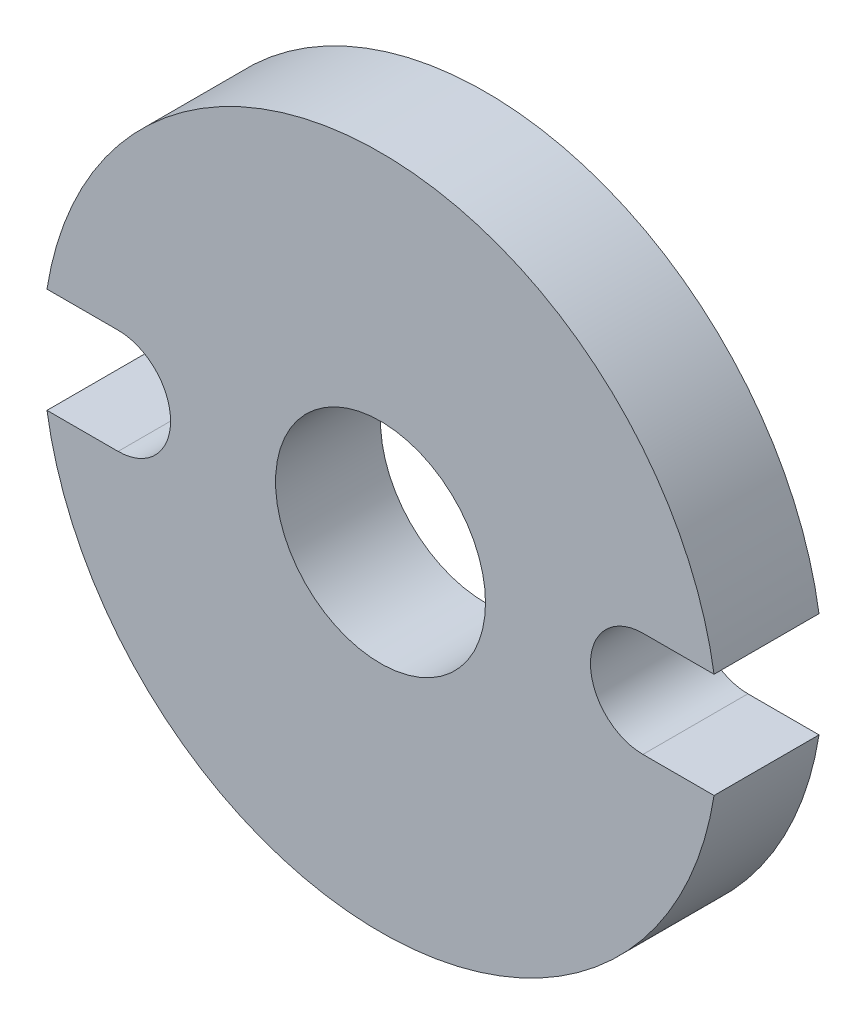
ISO-10303-21;
HEADER;
FILE_DESCRIPTION(('STEP AP214'),'2;1');
FILE_NAME('part.step','',(''),(''),'','','');
FILE_SCHEMA(('AUTOMOTIVE_DESIGN { 1 0 10303 214 1 1 1 1 }'));
ENDSEC;
DATA;
#1=APPLICATION_CONTEXT('core data for automotive mechanical design processes');
#2=APPLICATION_PROTOCOL_DEFINITION('international standard','automotive_design',2000,#1);
#3=PRODUCT_CONTEXT('',#1,'mechanical');
#4=PRODUCT('Part','Part','',(#3));
#5=PRODUCT_RELATED_PRODUCT_CATEGORY('part','',(#4));
#6=PRODUCT_DEFINITION_FORMATION('','',#4);
#7=PRODUCT_DEFINITION_CONTEXT('part definition',#1,'design');
#8=PRODUCT_DEFINITION('design','',#6,#7);
#9=PRODUCT_DEFINITION_SHAPE('','',#8);
#10=(LENGTH_UNIT() NAMED_UNIT(*) SI_UNIT(.MILLI.,.METRE.));
#11=(NAMED_UNIT(*) PLANE_ANGLE_UNIT() SI_UNIT($,.RADIAN.));
#12=(NAMED_UNIT(*) SI_UNIT($,.STERADIAN.) SOLID_ANGLE_UNIT());
#13=UNCERTAINTY_MEASURE_WITH_UNIT(LENGTH_MEASURE(1.E-05),#10,'distance_accuracy_value','');
#14=(GEOMETRIC_REPRESENTATION_CONTEXT(3) GLOBAL_UNCERTAINTY_ASSIGNED_CONTEXT((#13)) GLOBAL_UNIT_ASSIGNED_CONTEXT((#10,
#11,#12)) REPRESENTATION_CONTEXT('',''));
#15=CARTESIAN_POINT('',(0.,0.,0.));
#16=DIRECTION('',(0.,0.,1.));
#17=DIRECTION('',(1.,0.,0.));
#18=AXIS2_PLACEMENT_3D('',#15,#16,#17);
#19=CARTESIAN_POINT('',(0.,-0.749999999999997,1.5));
#20=DIRECTION('',(0.,-1.,0.));
#21=DIRECTION('',(1.,0.,0.));
#22=AXIS2_PLACEMENT_3D('',#19,#20,#21);
#23=PLANE('',#22);
#24=DIRECTION('',(-1.,0.,0.));
#25=VECTOR('',#24,1.);
#26=CARTESIAN_POINT('',(0.,-0.749999999999997,0.));
#27=LINE('',#26,#25);
#28=CARTESIAN_POINT('',(4.76635342793629,-0.749999999999996,0.));
#29=VERTEX_POINT('',#28);
#30=CARTESIAN_POINT('',(3.75,-0.749999999999996,0.));
#31=VERTEX_POINT('',#30);
#32=EDGE_CURVE('E136',#29,#31,#27,.T.);
#33=ORIENTED_EDGE('',*,*,#32,.T.);
#34=DIRECTION('',(0.,0.,-1.));
#35=VECTOR('',#34,1.);
#36=CARTESIAN_POINT('',(3.75,-0.749999999999996,1.5));
#37=LINE('',#36,#35);
#38=CARTESIAN_POINT('',(3.75,-0.749999999999996,1.5));
#39=VERTEX_POINT('',#38);
#40=EDGE_CURVE('E11',#39,#31,#37,.T.);
#41=ORIENTED_EDGE('',*,*,#40,.F.);
#42=DIRECTION('',(-1.,0.,0.));
#43=VECTOR('',#42,1.);
#44=CARTESIAN_POINT('',(0.,-0.749999999999997,1.5));
#45=LINE('',#44,#43);
#46=CARTESIAN_POINT('',(4.76635342793629,-0.749999999999996,1.5));
#47=VERTEX_POINT('',#46);
#48=EDGE_CURVE('E182',#47,#39,#45,.T.);
#49=ORIENTED_EDGE('',*,*,#48,.F.);
#50=DIRECTION('',(0.,0.,-1.));
#51=VECTOR('',#50,1.);
#52=CARTESIAN_POINT('',(4.76635342793629,-0.749999999999996,1.5));
#53=LINE('',#52,#51);
#54=EDGE_CURVE('E128',#47,#29,#53,.T.);
#55=ORIENTED_EDGE('',*,*,#54,.T.);
#56=EDGE_LOOP('',(#33,#41,#49,#55));
#57=FACE_BOUND('',#56,.T.);
#58=ADVANCED_FACE('F37',(#57),#23,.F.);
#59=CARTESIAN_POINT('',(3.75,0.,1.5));
#60=DIRECTION('',(0.,0.,-1.));
#61=DIRECTION('',(-1.,0.,0.));
#62=AXIS2_PLACEMENT_3D('',#59,#60,#61);
#63=CYLINDRICAL_SURFACE('',#62,0.749999999999996);
#64=CARTESIAN_POINT('',(3.75,0.,0.));
#65=DIRECTION('',(0.,0.,1.));
#66=DIRECTION('',(1.,0.,0.));
#67=AXIS2_PLACEMENT_3D('',#64,#65,#66);
#68=CIRCLE('',#67,0.749999999999996);
#69=CARTESIAN_POINT('',(3.75,0.749999999999995,0.));
#70=VERTEX_POINT('',#69);
#71=EDGE_CURVE('E139',#31,#70,#68,.F.);
#72=ORIENTED_EDGE('',*,*,#71,.T.);
#73=DIRECTION('',(0.,0.,-1.));
#74=VECTOR('',#73,1.);
#75=CARTESIAN_POINT('',(3.75,0.749999999999995,1.5));
#76=LINE('',#75,#74);
#77=CARTESIAN_POINT('',(3.75,0.749999999999995,1.5));
#78=VERTEX_POINT('',#77);
#79=EDGE_CURVE('E46',#78,#70,#76,.T.);
#80=ORIENTED_EDGE('',*,*,#79,.F.);
#81=CARTESIAN_POINT('',(3.75,0.,1.5));
#82=DIRECTION('',(0.,0.,1.));
#83=DIRECTION('',(1.,0.,0.));
#84=AXIS2_PLACEMENT_3D('',#81,#82,#83);
#85=CIRCLE('',#84,0.749999999999996);
#86=EDGE_CURVE('E93',#39,#78,#85,.F.);
#87=ORIENTED_EDGE('',*,*,#86,.F.);
#88=ORIENTED_EDGE('',*,*,#40,.T.);
#89=EDGE_LOOP('',(#72,#80,#87,#88));
#90=FACE_BOUND('',#89,.T.);
#91=ADVANCED_FACE('F166',(#90),#63,.F.);
#92=CARTESIAN_POINT('',(0.,0.749999999999995,1.5));
#93=DIRECTION('',(0.,-1.,0.));
#94=DIRECTION('',(0.,0.,-1.));
#95=AXIS2_PLACEMENT_3D('',#92,#93,#94);
#96=PLANE('',#95);
#97=DIRECTION('',(-1.,0.,0.));
#98=VECTOR('',#97,1.);
#99=CARTESIAN_POINT('',(0.,0.749999999999995,0.));
#100=LINE('',#99,#98);
#101=CARTESIAN_POINT('',(4.76635342793629,0.749999999999995,0.));
#102=VERTEX_POINT('',#101);
#103=EDGE_CURVE('E142',#102,#70,#100,.T.);
#104=ORIENTED_EDGE('',*,*,#103,.F.);
#105=DIRECTION('',(0.,0.,-1.));
#106=VECTOR('',#105,1.);
#107=CARTESIAN_POINT('',(4.76635342793629,0.749999999999995,1.5));
#108=LINE('',#107,#106);
#109=CARTESIAN_POINT('',(4.76635342793629,0.749999999999995,1.5));
#110=VERTEX_POINT('',#109);
#111=EDGE_CURVE('E159',#110,#102,#108,.T.);
#112=ORIENTED_EDGE('',*,*,#111,.F.);
#113=DIRECTION('',(-1.,0.,0.));
#114=VECTOR('',#113,1.);
#115=CARTESIAN_POINT('',(0.,0.749999999999995,1.5));
#116=LINE('',#115,#114);
#117=EDGE_CURVE('E165',#110,#78,#116,.T.);
#118=ORIENTED_EDGE('',*,*,#117,.T.);
#119=ORIENTED_EDGE('',*,*,#79,.T.);
#120=EDGE_LOOP('',(#104,#112,#118,#119));
#121=FACE_BOUND('',#120,.T.);
#122=ADVANCED_FACE('F163',(#121),#96,.T.);
#123=CARTESIAN_POINT('',(0.,0.,1.5));
#124=DIRECTION('',(0.,0.,-1.));
#125=DIRECTION('',(-1.,0.,0.));
#126=AXIS2_PLACEMENT_3D('',#123,#124,#125);
#127=CYLINDRICAL_SURFACE('',#126,4.825);
#128=CARTESIAN_POINT('',(0.,0.,0.));
#129=DIRECTION('',(0.,0.,1.));
#130=DIRECTION('',(1.,0.,0.));
#131=AXIS2_PLACEMENT_3D('',#128,#129,#130);
#132=CIRCLE('',#131,4.825);
#133=CARTESIAN_POINT('',(-4.76635342793629,0.749999999999995,0.));
#134=VERTEX_POINT('',#133);
#135=EDGE_CURVE('E145',#102,#134,#132,.T.);
#136=ORIENTED_EDGE('',*,*,#135,.T.);
#137=DIRECTION('',(0.,0.,-1.));
#138=VECTOR('',#137,1.);
#139=CARTESIAN_POINT('',(-4.76635342793629,0.749999999999995,1.5));
#140=LINE('',#139,#138);
#141=CARTESIAN_POINT('',(-4.76635342793629,0.749999999999995,1.5));
#142=VERTEX_POINT('',#141);
#143=EDGE_CURVE('E156',#142,#134,#140,.T.);
#144=ORIENTED_EDGE('',*,*,#143,.F.);
#145=CARTESIAN_POINT('',(0.,0.,1.5));
#146=DIRECTION('',(0.,0.,1.));
#147=DIRECTION('',(1.,0.,0.));
#148=AXIS2_PLACEMENT_3D('',#145,#146,#147);
#149=CIRCLE('',#148,4.825);
#150=EDGE_CURVE('E130',#110,#142,#149,.T.);
#151=ORIENTED_EDGE('',*,*,#150,.F.);
#152=ORIENTED_EDGE('',*,*,#111,.T.);
#153=EDGE_LOOP('',(#136,#144,#151,#152));
#154=FACE_BOUND('',#153,.T.);
#155=ADVANCED_FACE('F175',(#154),#127,.T.);
#156=CARTESIAN_POINT('',(0.,0.749999999999995,1.5));
#157=DIRECTION('',(0.,1.,0.));
#158=DIRECTION('',(0.,0.,1.));
#159=AXIS2_PLACEMENT_3D('',#156,#157,#158);
#160=PLANE('',#159);
#161=DIRECTION('',(1.,0.,0.));
#162=VECTOR('',#161,1.);
#163=CARTESIAN_POINT('',(0.,0.749999999999995,0.));
#164=LINE('',#163,#162);
#165=CARTESIAN_POINT('',(-3.75,0.749999999999995,0.));
#166=VERTEX_POINT('',#165);
#167=EDGE_CURVE('E147',#134,#166,#164,.T.);
#168=ORIENTED_EDGE('',*,*,#167,.T.);
#169=DIRECTION('',(0.,0.,-1.));
#170=VECTOR('',#169,1.);
#171=CARTESIAN_POINT('',(-3.75,0.749999999999995,1.5));
#172=LINE('',#171,#170);
#173=CARTESIAN_POINT('',(-3.75,0.749999999999995,1.5));
#174=VERTEX_POINT('',#173);
#175=EDGE_CURVE('E118',#174,#166,#172,.T.);
#176=ORIENTED_EDGE('',*,*,#175,.F.);
#177=DIRECTION('',(1.,0.,0.));
#178=VECTOR('',#177,1.);
#179=CARTESIAN_POINT('',(0.,0.749999999999995,1.5));
#180=LINE('',#179,#178);
#181=EDGE_CURVE('E123',#142,#174,#180,.T.);
#182=ORIENTED_EDGE('',*,*,#181,.F.);
#183=ORIENTED_EDGE('',*,*,#143,.T.);
#184=EDGE_LOOP('',(#168,#176,#182,#183));
#185=FACE_BOUND('',#184,.T.);
#186=ADVANCED_FACE('F178',(#185),#160,.F.);
#187=CARTESIAN_POINT('',(-3.75,0.,1.5));
#188=DIRECTION('',(0.,0.,-1.));
#189=DIRECTION('',(-1.,0.,0.));
#190=AXIS2_PLACEMENT_3D('',#187,#188,#189);
#191=CYLINDRICAL_SURFACE('',#190,0.749999999999996);
#192=CARTESIAN_POINT('',(-3.75,0.,0.));
#193=DIRECTION('',(0.,0.,1.));
#194=DIRECTION('',(1.,0.,0.));
#195=AXIS2_PLACEMENT_3D('',#192,#193,#194);
#196=CIRCLE('',#195,0.749999999999996);
#197=CARTESIAN_POINT('',(-3.75,-0.749999999999996,0.));
#198=VERTEX_POINT('',#197);
#199=EDGE_CURVE('E113',#198,#166,#196,.T.);
#200=ORIENTED_EDGE('',*,*,#199,.F.);
#201=DIRECTION('',(0.,0.,-1.));
#202=VECTOR('',#201,1.);
#203=CARTESIAN_POINT('',(-3.75,-0.749999999999996,1.5));
#204=LINE('',#203,#202);
#205=CARTESIAN_POINT('',(-3.75,-0.749999999999996,1.5));
#206=VERTEX_POINT('',#205);
#207=EDGE_CURVE('E108',#206,#198,#204,.T.);
#208=ORIENTED_EDGE('',*,*,#207,.F.);
#209=CARTESIAN_POINT('',(-3.75,0.,1.5));
#210=DIRECTION('',(0.,0.,1.));
#211=DIRECTION('',(1.,0.,0.));
#212=AXIS2_PLACEMENT_3D('',#209,#210,#211);
#213=CIRCLE('',#212,0.749999999999996);
#214=EDGE_CURVE('E111',#206,#174,#213,.T.);
#215=ORIENTED_EDGE('',*,*,#214,.T.);
#216=ORIENTED_EDGE('',*,*,#175,.T.);
#217=EDGE_LOOP('',(#200,#208,#215,#216));
#218=FACE_BOUND('',#217,.T.);
#219=ADVANCED_FACE('F110',(#218),#191,.F.);
#220=CARTESIAN_POINT('',(0.,-0.749999999999997,1.5));
#221=DIRECTION('',(0.,1.,0.));
#222=DIRECTION('',(-1.,0.,0.));
#223=AXIS2_PLACEMENT_3D('',#220,#221,#222);
#224=PLANE('',#223);
#225=DIRECTION('',(1.,0.,0.));
#226=VECTOR('',#225,1.);
#227=CARTESIAN_POINT('',(0.,-0.749999999999997,0.));
#228=LINE('',#227,#226);
#229=CARTESIAN_POINT('',(-4.76635342793629,-0.749999999999996,0.));
#230=VERTEX_POINT('',#229);
#231=EDGE_CURVE('E151',#230,#198,#228,.T.);
#232=ORIENTED_EDGE('',*,*,#231,.F.);
#233=DIRECTION('',(0.,0.,-1.));
#234=VECTOR('',#233,1.);
#235=CARTESIAN_POINT('',(-4.76635342793629,-0.749999999999996,1.5));
#236=LINE('',#235,#234);
#237=CARTESIAN_POINT('',(-4.76635342793629,-0.749999999999996,1.5));
#238=VERTEX_POINT('',#237);
#239=EDGE_CURVE('E82',#238,#230,#236,.T.);
#240=ORIENTED_EDGE('',*,*,#239,.F.);
#241=DIRECTION('',(1.,0.,0.));
#242=VECTOR('',#241,1.);
#243=CARTESIAN_POINT('',(0.,-0.749999999999997,1.5));
#244=LINE('',#243,#242);
#245=EDGE_CURVE('E121',#238,#206,#244,.T.);
#246=ORIENTED_EDGE('',*,*,#245,.T.);
#247=ORIENTED_EDGE('',*,*,#207,.T.);
#248=EDGE_LOOP('',(#232,#240,#246,#247));
#249=FACE_BOUND('',#248,.T.);
#250=ADVANCED_FACE('F126',(#249),#224,.T.);
#251=CARTESIAN_POINT('',(0.,0.,1.5));
#252=DIRECTION('',(0.,0.,-1.));
#253=DIRECTION('',(-1.,0.,0.));
#254=AXIS2_PLACEMENT_3D('',#251,#252,#253);
#255=CYLINDRICAL_SURFACE('',#254,1.5);
#256=CARTESIAN_POINT('',(0.,0.,1.5));
#257=DIRECTION('',(0.,0.,1.));
#258=DIRECTION('',(1.,0.,0.));
#259=AXIS2_PLACEMENT_3D('',#256,#257,#258);
#260=CIRCLE('',#259,1.5);
#261=CARTESIAN_POINT('',(1.5,0.,1.5));
#262=VERTEX_POINT('',#261);
#263=EDGE_CURVE('E184',#262,#262,#260,.T.);
#264=ORIENTED_EDGE('',*,*,#263,.T.);
#265=EDGE_LOOP('',(#264));
#266=FACE_BOUND('',#265,.T.);
#267=CARTESIAN_POINT('',(0.,0.,0.));
#268=DIRECTION('',(0.,0.,1.));
#269=DIRECTION('',(1.,0.,0.));
#270=AXIS2_PLACEMENT_3D('',#267,#268,#269);
#271=CIRCLE('',#270,1.5);
#272=CARTESIAN_POINT('',(1.5,0.,0.));
#273=VERTEX_POINT('',#272);
#274=EDGE_CURVE('E133',#273,#273,#271,.T.);
#275=ORIENTED_EDGE('',*,*,#274,.F.);
#276=EDGE_LOOP('',(#275));
#277=FACE_BOUND('',#276,.T.);
#278=ADVANCED_FACE('F39',(#266,#277),#255,.F.);
#279=EDGE_CURVE('E85',#230,#29,#132,.T.);
#280=ORIENTED_EDGE('',*,*,#279,.T.);
#281=ORIENTED_EDGE('',*,*,#54,.F.);
#282=EDGE_CURVE('E54',#238,#47,#149,.T.);
#283=ORIENTED_EDGE('',*,*,#282,.F.);
#284=ORIENTED_EDGE('',*,*,#239,.T.);
#285=EDGE_LOOP('',(#280,#281,#283,#284));
#286=FACE_BOUND('',#285,.T.);
#287=ADVANCED_FACE('F191',(#286),#127,.T.);
#288=CARTESIAN_POINT('',(0.,0.,1.5));
#289=DIRECTION('',(0.,0.,1.));
#290=DIRECTION('',(1.,0.,0.));
#291=AXIS2_PLACEMENT_3D('',#288,#289,#290);
#292=PLANE('',#291);
#293=ORIENTED_EDGE('',*,*,#263,.F.);
#294=EDGE_LOOP('',(#293));
#295=FACE_BOUND('',#294,.T.);
#296=ORIENTED_EDGE('',*,*,#48,.T.);
#297=ORIENTED_EDGE('',*,*,#86,.T.);
#298=ORIENTED_EDGE('',*,*,#117,.F.);
#299=ORIENTED_EDGE('',*,*,#150,.T.);
#300=ORIENTED_EDGE('',*,*,#181,.T.);
#301=ORIENTED_EDGE('',*,*,#214,.F.);
#302=ORIENTED_EDGE('',*,*,#245,.F.);
#303=ORIENTED_EDGE('',*,*,#282,.T.);
#304=EDGE_LOOP('',(#296,#297,#298,#299,#300,#301,#302,#303));
#305=FACE_BOUND('',#304,.T.);
#306=ADVANCED_FACE('F120',(#295,#305),#292,.T.);
#307=CARTESIAN_POINT('',(0.,0.,0.));
#308=DIRECTION('',(0.,0.,1.));
#309=DIRECTION('',(1.,0.,0.));
#310=AXIS2_PLACEMENT_3D('',#307,#308,#309);
#311=PLANE('',#310);
#312=ORIENTED_EDGE('',*,*,#274,.T.);
#313=EDGE_LOOP('',(#312));
#314=FACE_BOUND('',#313,.T.);
#315=ORIENTED_EDGE('',*,*,#32,.F.);
#316=ORIENTED_EDGE('',*,*,#279,.F.);
#317=ORIENTED_EDGE('',*,*,#231,.T.);
#318=ORIENTED_EDGE('',*,*,#199,.T.);
#319=ORIENTED_EDGE('',*,*,#167,.F.);
#320=ORIENTED_EDGE('',*,*,#135,.F.);
#321=ORIENTED_EDGE('',*,*,#103,.T.);
#322=ORIENTED_EDGE('',*,*,#71,.F.);
#323=EDGE_LOOP('',(#315,#316,#317,#318,#319,#320,#321,#322));
#324=FACE_BOUND('',#323,.T.);
#325=ADVANCED_FACE('F171',(#314,#324),#311,.F.);
#326=CLOSED_SHELL('',(#58,#91,#122,#155,#186,#219,#250,#278,#287,#306,#325));
#327=MANIFOLD_SOLID_BREP('B2',#326);
#328=ADVANCED_BREP_SHAPE_REPRESENTATION('',(#18,#327),#14);
#329=SHAPE_DEFINITION_REPRESENTATION(#9,#328);
ENDSEC;
END-ISO-10303-21;
